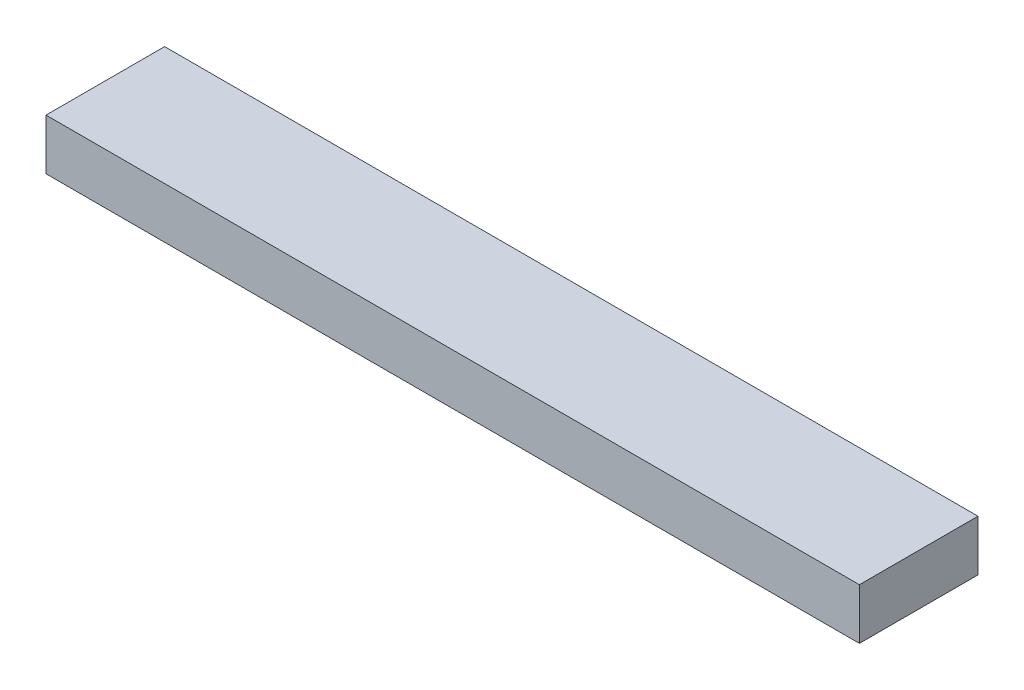
ISO-10303-21;
HEADER;
FILE_DESCRIPTION(('STEP AP214'),'2;1');
FILE_NAME('part.step','',(''),(''),'','','');
FILE_SCHEMA(('AUTOMOTIVE_DESIGN { 1 0 10303 214 1 1 1 1 }'));
ENDSEC;
DATA;
#1=APPLICATION_CONTEXT('core data for automotive mechanical design processes');
#2=APPLICATION_PROTOCOL_DEFINITION('international standard','automotive_design',2000,#1);
#3=PRODUCT_CONTEXT('',#1,'mechanical');
#4=PRODUCT('Part','Part','',(#3));
#5=PRODUCT_RELATED_PRODUCT_CATEGORY('part','',(#4));
#6=PRODUCT_DEFINITION_FORMATION('','',#4);
#7=PRODUCT_DEFINITION_CONTEXT('part definition',#1,'design');
#8=PRODUCT_DEFINITION('design','',#6,#7);
#9=PRODUCT_DEFINITION_SHAPE('','',#8);
#10=(LENGTH_UNIT() NAMED_UNIT(*) SI_UNIT(.MILLI.,.METRE.));
#11=(NAMED_UNIT(*) PLANE_ANGLE_UNIT() SI_UNIT($,.RADIAN.));
#12=(NAMED_UNIT(*) SI_UNIT($,.STERADIAN.) SOLID_ANGLE_UNIT());
#13=UNCERTAINTY_MEASURE_WITH_UNIT(LENGTH_MEASURE(1.E-05),#10,'distance_accuracy_value','');
#14=(GEOMETRIC_REPRESENTATION_CONTEXT(3) GLOBAL_UNCERTAINTY_ASSIGNED_CONTEXT((#13)) GLOBAL_UNIT_ASSIGNED_CONTEXT((#10,
#11,#12)) REPRESENTATION_CONTEXT('',''));
#15=CARTESIAN_POINT('',(0.,0.,0.));
#16=DIRECTION('',(0.,0.,1.));
#17=DIRECTION('',(1.,0.,0.));
#18=AXIS2_PLACEMENT_3D('',#15,#16,#17);
#19=CARTESIAN_POINT('',(609.6,-19.05,44.45));
#20=DIRECTION('',(0.,1.,0.));
#21=DIRECTION('',(0.,0.,1.));
#22=AXIS2_PLACEMENT_3D('',#19,#20,#21);
#23=PLANE('',#22);
#24=DIRECTION('',(0.,0.,-1.));
#25=VECTOR('',#24,1.);
#26=CARTESIAN_POINT('',(0.,-19.05,44.45));
#27=LINE('',#26,#25);
#28=CARTESIAN_POINT('',(0.,-19.05,44.45));
#29=VERTEX_POINT('',#28);
#30=CARTESIAN_POINT('',(0.,-19.05,-44.45));
#31=VERTEX_POINT('',#30);
#32=EDGE_CURVE('E96',#29,#31,#27,.T.);
#33=ORIENTED_EDGE('',*,*,#32,.T.);
#34=DIRECTION('',(-1.,0.,0.));
#35=VECTOR('',#34,1.);
#36=CARTESIAN_POINT('',(609.6,-19.05,-44.45));
#37=LINE('',#36,#35);
#38=CARTESIAN_POINT('',(609.6,-19.05,-44.45));
#39=VERTEX_POINT('',#38);
#40=EDGE_CURVE('E11',#39,#31,#37,.T.);
#41=ORIENTED_EDGE('',*,*,#40,.F.);
#42=DIRECTION('',(0.,0.,-1.));
#43=VECTOR('',#42,1.);
#44=CARTESIAN_POINT('',(609.6,-19.05,44.45));
#45=LINE('',#44,#43);
#46=CARTESIAN_POINT('',(609.6,-19.05,44.45));
#47=VERTEX_POINT('',#46);
#48=EDGE_CURVE('E84',#47,#39,#45,.T.);
#49=ORIENTED_EDGE('',*,*,#48,.F.);
#50=DIRECTION('',(-1.,0.,0.));
#51=VECTOR('',#50,1.);
#52=CARTESIAN_POINT('',(609.6,-19.05,44.45));
#53=LINE('',#52,#51);
#54=EDGE_CURVE('E92',#47,#29,#53,.T.);
#55=ORIENTED_EDGE('',*,*,#54,.T.);
#56=EDGE_LOOP('',(#33,#41,#49,#55));
#57=FACE_BOUND('',#56,.T.);
#58=ADVANCED_FACE('F33',(#57),#23,.F.);
#59=CARTESIAN_POINT('',(609.6,19.05,-44.45));
#60=DIRECTION('',(0.,0.,1.));
#61=DIRECTION('',(1.,0.,0.));
#62=AXIS2_PLACEMENT_3D('',#59,#60,#61);
#63=PLANE('',#62);
#64=DIRECTION('',(0.,1.,0.));
#65=VECTOR('',#64,1.);
#66=CARTESIAN_POINT('',(0.,19.05,-44.45));
#67=LINE('',#66,#65);
#68=CARTESIAN_POINT('',(0.,19.05,-44.45));
#69=VERTEX_POINT('',#68);
#70=EDGE_CURVE('E88',#31,#69,#67,.T.);
#71=ORIENTED_EDGE('',*,*,#70,.T.);
#72=DIRECTION('',(-1.,0.,0.));
#73=VECTOR('',#72,1.);
#74=CARTESIAN_POINT('',(609.6,19.05,-44.45));
#75=LINE('',#74,#73);
#76=CARTESIAN_POINT('',(609.6,19.05,-44.45));
#77=VERTEX_POINT('',#76);
#78=EDGE_CURVE('E41',#77,#69,#75,.T.);
#79=ORIENTED_EDGE('',*,*,#78,.F.);
#80=DIRECTION('',(0.,1.,0.));
#81=VECTOR('',#80,1.);
#82=CARTESIAN_POINT('',(609.6,19.05,-44.45));
#83=LINE('',#82,#81);
#84=EDGE_CURVE('E79',#39,#77,#83,.T.);
#85=ORIENTED_EDGE('',*,*,#84,.F.);
#86=ORIENTED_EDGE('',*,*,#40,.T.);
#87=EDGE_LOOP('',(#71,#79,#85,#86));
#88=FACE_BOUND('',#87,.T.);
#89=ADVANCED_FACE('F87',(#88),#63,.F.);
#90=CARTESIAN_POINT('',(609.6,19.05,44.45));
#91=DIRECTION('',(0.,-1.,0.));
#92=DIRECTION('',(0.,0.,-1.));
#93=AXIS2_PLACEMENT_3D('',#90,#91,#92);
#94=PLANE('',#93);
#95=DIRECTION('',(0.,0.,1.));
#96=VECTOR('',#95,1.);
#97=CARTESIAN_POINT('',(0.,19.05,44.45));
#98=LINE('',#97,#96);
#99=CARTESIAN_POINT('',(0.,19.05,44.45));
#100=VERTEX_POINT('',#99);
#101=EDGE_CURVE('E66',#69,#100,#98,.T.);
#102=ORIENTED_EDGE('',*,*,#101,.T.);
#103=DIRECTION('',(-1.,0.,0.));
#104=VECTOR('',#103,1.);
#105=CARTESIAN_POINT('',(609.6,19.05,44.45));
#106=LINE('',#105,#104);
#107=CARTESIAN_POINT('',(609.6,19.05,44.45));
#108=VERTEX_POINT('',#107);
#109=EDGE_CURVE('E89',#108,#100,#106,.T.);
#110=ORIENTED_EDGE('',*,*,#109,.F.);
#111=DIRECTION('',(0.,0.,1.));
#112=VECTOR('',#111,1.);
#113=CARTESIAN_POINT('',(609.6,19.05,44.45));
#114=LINE('',#113,#112);
#115=EDGE_CURVE('E82',#77,#108,#114,.T.);
#116=ORIENTED_EDGE('',*,*,#115,.F.);
#117=ORIENTED_EDGE('',*,*,#78,.T.);
#118=EDGE_LOOP('',(#102,#110,#116,#117));
#119=FACE_BOUND('',#118,.T.);
#120=ADVANCED_FACE('F90',(#119),#94,.F.);
#121=CARTESIAN_POINT('',(609.6,19.05,44.45));
#122=DIRECTION('',(0.,0.,-1.));
#123=DIRECTION('',(-1.,0.,0.));
#124=AXIS2_PLACEMENT_3D('',#121,#122,#123);
#125=PLANE('',#124);
#126=DIRECTION('',(0.,-1.,0.));
#127=VECTOR('',#126,1.);
#128=CARTESIAN_POINT('',(0.,19.05,44.45));
#129=LINE('',#128,#127);
#130=EDGE_CURVE('E72',#100,#29,#129,.T.);
#131=ORIENTED_EDGE('',*,*,#130,.T.);
#132=ORIENTED_EDGE('',*,*,#54,.F.);
#133=DIRECTION('',(0.,-1.,0.));
#134=VECTOR('',#133,1.);
#135=CARTESIAN_POINT('',(609.6,19.05,44.45));
#136=LINE('',#135,#134);
#137=EDGE_CURVE('E49',#108,#47,#136,.T.);
#138=ORIENTED_EDGE('',*,*,#137,.F.);
#139=ORIENTED_EDGE('',*,*,#109,.T.);
#140=EDGE_LOOP('',(#131,#132,#138,#139));
#141=FACE_BOUND('',#140,.T.);
#142=ADVANCED_FACE('F103',(#141),#125,.F.);
#143=CARTESIAN_POINT('',(609.6,0.,0.));
#144=DIRECTION('',(-1.,0.,0.));
#145=DIRECTION('',(0.,0.,1.));
#146=AXIS2_PLACEMENT_3D('',#143,#144,#145);
#147=PLANE('',#146);
#148=ORIENTED_EDGE('',*,*,#48,.T.);
#149=ORIENTED_EDGE('',*,*,#84,.T.);
#150=ORIENTED_EDGE('',*,*,#115,.T.);
#151=ORIENTED_EDGE('',*,*,#137,.T.);
#152=EDGE_LOOP('',(#148,#149,#150,#151));
#153=FACE_BOUND('',#152,.T.);
#154=ADVANCED_FACE('F80',(#153),#147,.F.);
#155=CARTESIAN_POINT('',(0.,0.,0.));
#156=DIRECTION('',(-1.,0.,0.));
#157=DIRECTION('',(0.,0.,1.));
#158=AXIS2_PLACEMENT_3D('',#155,#156,#157);
#159=PLANE('',#158);
#160=ORIENTED_EDGE('',*,*,#32,.F.);
#161=ORIENTED_EDGE('',*,*,#130,.F.);
#162=ORIENTED_EDGE('',*,*,#101,.F.);
#163=ORIENTED_EDGE('',*,*,#70,.F.);
#164=EDGE_LOOP('',(#160,#161,#162,#163));
#165=FACE_BOUND('',#164,.T.);
#166=ADVANCED_FACE('F106',(#165),#159,.T.);
#167=CLOSED_SHELL('',(#58,#89,#120,#142,#154,#166));
#168=MANIFOLD_SOLID_BREP('B2',#167);
#169=ADVANCED_BREP_SHAPE_REPRESENTATION('',(#18,#168),#14);
#170=SHAPE_DEFINITION_REPRESENTATION(#9,#169);
ENDSEC;
END-ISO-10303-21;
